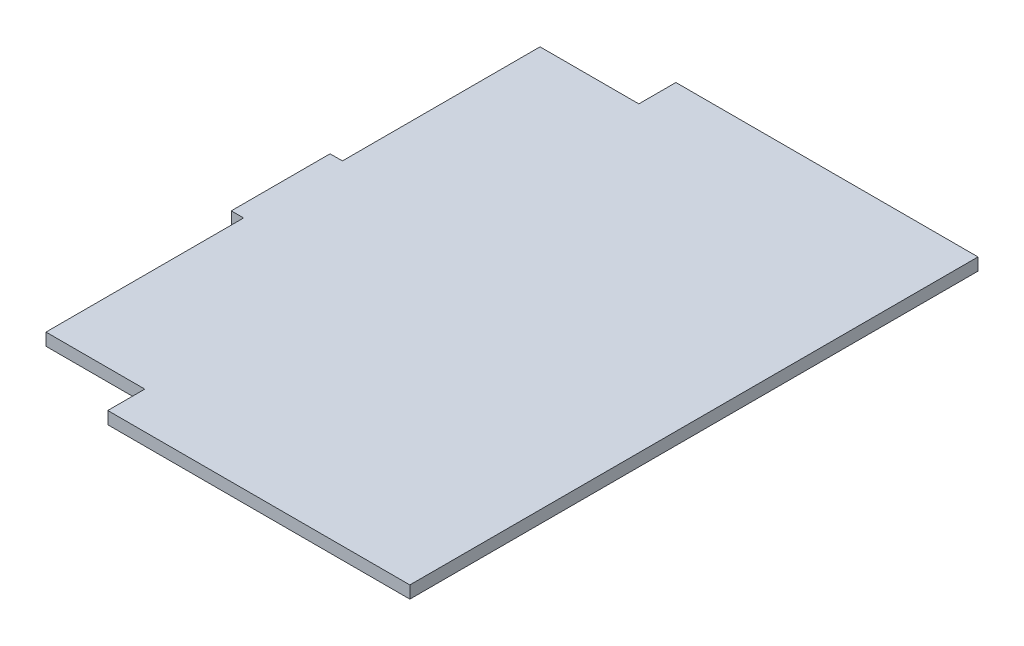
ISO-10303-21;
HEADER;
FILE_DESCRIPTION(('STEP AP214'),'2;1');
FILE_NAME('part.step','',(''),(''),'','','');
FILE_SCHEMA(('AUTOMOTIVE_DESIGN { 1 0 10303 214 1 1 1 1 }'));
ENDSEC;
DATA;
#1=APPLICATION_CONTEXT('core data for automotive mechanical design processes');
#2=APPLICATION_PROTOCOL_DEFINITION('international standard','automotive_design',2000,#1);
#3=PRODUCT_CONTEXT('',#1,'mechanical');
#4=PRODUCT('Part','Part','',(#3));
#5=PRODUCT_RELATED_PRODUCT_CATEGORY('part','',(#4));
#6=PRODUCT_DEFINITION_FORMATION('','',#4);
#7=PRODUCT_DEFINITION_CONTEXT('part definition',#1,'design');
#8=PRODUCT_DEFINITION('design','',#6,#7);
#9=PRODUCT_DEFINITION_SHAPE('','',#8);
#10=(LENGTH_UNIT() NAMED_UNIT(*) SI_UNIT(.MILLI.,.METRE.));
#11=(NAMED_UNIT(*) PLANE_ANGLE_UNIT() SI_UNIT($,.RADIAN.));
#12=(NAMED_UNIT(*) SI_UNIT($,.STERADIAN.) SOLID_ANGLE_UNIT());
#13=UNCERTAINTY_MEASURE_WITH_UNIT(LENGTH_MEASURE(1.E-05),#10,'distance_accuracy_value','');
#14=(GEOMETRIC_REPRESENTATION_CONTEXT(3) GLOBAL_UNCERTAINTY_ASSIGNED_CONTEXT((#13)) GLOBAL_UNIT_ASSIGNED_CONTEXT((#10,
#11,#12)) REPRESENTATION_CONTEXT('',''));
#15=CARTESIAN_POINT('',(0.,0.,0.));
#16=DIRECTION('',(0.,0.,1.));
#17=DIRECTION('',(1.,0.,0.));
#18=AXIS2_PLACEMENT_3D('',#15,#16,#17);
#19=CARTESIAN_POINT('',(0.,3.175,73.025));
#20=DIRECTION('',(0.,0.,1.));
#21=DIRECTION('',(1.,0.,0.));
#22=AXIS2_PLACEMENT_3D('',#19,#20,#21);
#23=PLANE('',#22);
#24=DIRECTION('',(0.,-1.,0.));
#25=VECTOR('',#24,1.);
#26=CARTESIAN_POINT('',(36.926256602,3.175,73.025));
#27=LINE('',#26,#25);
#28=CARTESIAN_POINT('',(36.926256602,3.175,73.025));
#29=VERTEX_POINT('',#28);
#30=CARTESIAN_POINT('',(36.926256602,0.,73.025));
#31=VERTEX_POINT('',#30);
#32=EDGE_CURVE('E53',#29,#31,#27,.T.);
#33=ORIENTED_EDGE('',*,*,#32,.F.);
#34=DIRECTION('',(-1.,0.,0.));
#35=VECTOR('',#34,1.);
#36=CARTESIAN_POINT('',(0.,3.175,73.025));
#37=LINE('',#36,#35);
#38=CARTESIAN_POINT('',(-40.7362566019999,3.175,73.025));
#39=VERTEX_POINT('',#38);
#40=EDGE_CURVE('E61',#29,#39,#37,.T.);
#41=ORIENTED_EDGE('',*,*,#40,.T.);
#42=DIRECTION('',(0.,-1.,0.));
#43=VECTOR('',#42,1.);
#44=CARTESIAN_POINT('',(-40.7362566019999,3.175,73.025));
#45=LINE('',#44,#43);
#46=CARTESIAN_POINT('',(-40.7362566019999,0.,73.025));
#47=VERTEX_POINT('',#46);
#48=EDGE_CURVE('E218',#39,#47,#45,.T.);
#49=ORIENTED_EDGE('',*,*,#48,.T.);
#50=DIRECTION('',(-1.,0.,0.));
#51=VECTOR('',#50,1.);
#52=CARTESIAN_POINT('',(0.,0.,73.025));
#53=LINE('',#52,#51);
#54=EDGE_CURVE('E101',#31,#47,#53,.T.);
#55=ORIENTED_EDGE('',*,*,#54,.F.);
#56=EDGE_LOOP('',(#33,#41,#49,#55));
#57=FACE_BOUND('',#56,.T.);
#58=ADVANCED_FACE('F39',(#57),#23,.T.);
#59=CARTESIAN_POINT('',(0.,3.175,-73.025));
#60=DIRECTION('',(0.,0.,1.));
#61=DIRECTION('',(1.,0.,0.));
#62=AXIS2_PLACEMENT_3D('',#59,#60,#61);
#63=PLANE('',#62);
#64=DIRECTION('',(-1.,0.,0.));
#65=VECTOR('',#64,1.);
#66=CARTESIAN_POINT('',(0.,3.175,-73.025));
#67=LINE('',#66,#65);
#68=CARTESIAN_POINT('',(36.926256602,3.175,-73.025));
#69=VERTEX_POINT('',#68);
#70=CARTESIAN_POINT('',(-40.7362566019999,3.175,-73.025));
#71=VERTEX_POINT('',#70);
#72=EDGE_CURVE('E109',#69,#71,#67,.T.);
#73=ORIENTED_EDGE('',*,*,#72,.F.);
#74=DIRECTION('',(0.,-1.,0.));
#75=VECTOR('',#74,1.);
#76=CARTESIAN_POINT('',(36.926256602,3.175,-73.025));
#77=LINE('',#76,#75);
#78=CARTESIAN_POINT('',(36.926256602,0.,-73.025));
#79=VERTEX_POINT('',#78);
#80=EDGE_CURVE('E179',#69,#79,#77,.T.);
#81=ORIENTED_EDGE('',*,*,#80,.T.);
#82=DIRECTION('',(-1.,0.,0.));
#83=VECTOR('',#82,1.);
#84=CARTESIAN_POINT('',(0.,0.,-73.025));
#85=LINE('',#84,#83);
#86=CARTESIAN_POINT('',(-40.7362566019999,0.,-73.025));
#87=VERTEX_POINT('',#86);
#88=EDGE_CURVE('E193',#79,#87,#85,.T.);
#89=ORIENTED_EDGE('',*,*,#88,.T.);
#90=DIRECTION('',(0.,-1.,0.));
#91=VECTOR('',#90,1.);
#92=CARTESIAN_POINT('',(-40.7362566019999,3.175,-73.025));
#93=LINE('',#92,#91);
#94=EDGE_CURVE('E11',#71,#87,#93,.T.);
#95=ORIENTED_EDGE('',*,*,#94,.F.);
#96=EDGE_LOOP('',(#73,#81,#89,#95));
#97=FACE_BOUND('',#96,.T.);
#98=ADVANCED_FACE('F190',(#97),#63,.F.);
#99=CARTESIAN_POINT('',(-40.7362566019999,3.175,0.));
#100=DIRECTION('',(1.,0.,0.));
#101=DIRECTION('',(0.,0.,-1.));
#102=AXIS2_PLACEMENT_3D('',#99,#100,#101);
#103=PLANE('',#102);
#104=DIRECTION('',(0.,0.,1.));
#105=VECTOR('',#104,1.);
#106=CARTESIAN_POINT('',(-40.7362566019999,0.,0.));
#107=LINE('',#106,#105);
#108=CARTESIAN_POINT('',(-40.7362566019999,0.,-63.5));
#109=VERTEX_POINT('',#108);
#110=EDGE_CURVE('E221',#87,#109,#107,.T.);
#111=ORIENTED_EDGE('',*,*,#110,.T.);
#112=DIRECTION('',(0.,-1.,0.));
#113=VECTOR('',#112,1.);
#114=CARTESIAN_POINT('',(-40.7362566019999,3.175,-63.5));
#115=LINE('',#114,#113);
#116=CARTESIAN_POINT('',(-40.7362566019999,3.175,-63.5));
#117=VERTEX_POINT('',#116);
#118=EDGE_CURVE('E46',#117,#109,#115,.T.);
#119=ORIENTED_EDGE('',*,*,#118,.F.);
#120=DIRECTION('',(0.,0.,1.));
#121=VECTOR('',#120,1.);
#122=CARTESIAN_POINT('',(-40.7362566019999,3.175,0.));
#123=LINE('',#122,#121);
#124=EDGE_CURVE('E171',#71,#117,#123,.T.);
#125=ORIENTED_EDGE('',*,*,#124,.F.);
#126=ORIENTED_EDGE('',*,*,#94,.T.);
#127=EDGE_LOOP('',(#111,#119,#125,#126));
#128=FACE_BOUND('',#127,.T.);
#129=ADVANCED_FACE('F198',(#128),#103,.F.);
#130=CARTESIAN_POINT('',(0.,3.175,-63.5));
#131=DIRECTION('',(0.,0.,-1.));
#132=DIRECTION('',(-1.,0.,0.));
#133=AXIS2_PLACEMENT_3D('',#130,#131,#132);
#134=PLANE('',#133);
#135=DIRECTION('',(1.,0.,0.));
#136=VECTOR('',#135,1.);
#137=CARTESIAN_POINT('',(0.,0.,-63.5));
#138=LINE('',#137,#136);
#139=CARTESIAN_POINT('',(-66.136256602,0.,-63.5));
#140=VERTEX_POINT('',#139);
#141=EDGE_CURVE('E223',#140,#109,#138,.T.);
#142=ORIENTED_EDGE('',*,*,#141,.F.);
#143=DIRECTION('',(0.,-1.,0.));
#144=VECTOR('',#143,1.);
#145=CARTESIAN_POINT('',(-66.136256602,3.175,-63.5));
#146=LINE('',#145,#144);
#147=CARTESIAN_POINT('',(-66.136256602,3.175,-63.5));
#148=VERTEX_POINT('',#147);
#149=EDGE_CURVE('E243',#148,#140,#146,.T.);
#150=ORIENTED_EDGE('',*,*,#149,.F.);
#151=DIRECTION('',(1.,0.,0.));
#152=VECTOR('',#151,1.);
#153=CARTESIAN_POINT('',(0.,3.175,-63.5));
#154=LINE('',#153,#152);
#155=EDGE_CURVE('E167',#148,#117,#154,.T.);
#156=ORIENTED_EDGE('',*,*,#155,.T.);
#157=ORIENTED_EDGE('',*,*,#118,.T.);
#158=EDGE_LOOP('',(#142,#150,#156,#157));
#159=FACE_BOUND('',#158,.T.);
#160=ADVANCED_FACE('F245',(#159),#134,.T.);
#161=CARTESIAN_POINT('',(-66.136256602,3.175,0.));
#162=DIRECTION('',(-1.,0.,0.));
#163=DIRECTION('',(0.,0.,1.));
#164=AXIS2_PLACEMENT_3D('',#161,#162,#163);
#165=PLANE('',#164);
#166=DIRECTION('',(0.,0.,-1.));
#167=VECTOR('',#166,1.);
#168=CARTESIAN_POINT('',(-66.136256602,0.,0.));
#169=LINE('',#168,#167);
#170=CARTESIAN_POINT('',(-66.136256602,0.,-12.7));
#171=VERTEX_POINT('',#170);
#172=EDGE_CURVE('E226',#171,#140,#169,.T.);
#173=ORIENTED_EDGE('',*,*,#172,.F.);
#174=DIRECTION('',(0.,-1.,0.));
#175=VECTOR('',#174,1.);
#176=CARTESIAN_POINT('',(-66.136256602,3.175,-12.7));
#177=LINE('',#176,#175);
#178=CARTESIAN_POINT('',(-66.136256602,3.175,-12.7));
#179=VERTEX_POINT('',#178);
#180=EDGE_CURVE('E211',#179,#171,#177,.T.);
#181=ORIENTED_EDGE('',*,*,#180,.F.);
#182=DIRECTION('',(0.,0.,-1.));
#183=VECTOR('',#182,1.);
#184=CARTESIAN_POINT('',(-66.136256602,3.175,0.));
#185=LINE('',#184,#183);
#186=EDGE_CURVE('E160',#179,#148,#185,.T.);
#187=ORIENTED_EDGE('',*,*,#186,.T.);
#188=ORIENTED_EDGE('',*,*,#149,.T.);
#189=EDGE_LOOP('',(#173,#181,#187,#188));
#190=FACE_BOUND('',#189,.T.);
#191=ADVANCED_FACE('F248',(#190),#165,.T.);
#192=CARTESIAN_POINT('',(0.,3.175,-12.7));
#193=DIRECTION('',(0.,0.,1.));
#194=DIRECTION('',(1.,0.,0.));
#195=AXIS2_PLACEMENT_3D('',#192,#193,#194);
#196=PLANE('',#195);
#197=DIRECTION('',(-1.,0.,0.));
#198=VECTOR('',#197,1.);
#199=CARTESIAN_POINT('',(0.,0.,-12.7));
#200=LINE('',#199,#198);
#201=CARTESIAN_POINT('',(-69.311256602,0.,-12.7));
#202=VERTEX_POINT('',#201);
#203=EDGE_CURVE('E207',#171,#202,#200,.T.);
#204=ORIENTED_EDGE('',*,*,#203,.T.);
#205=DIRECTION('',(0.,-1.,0.));
#206=VECTOR('',#205,1.);
#207=CARTESIAN_POINT('',(-69.311256602,3.175,-12.7));
#208=LINE('',#207,#206);
#209=CARTESIAN_POINT('',(-69.311256602,3.175,-12.7));
#210=VERTEX_POINT('',#209);
#211=EDGE_CURVE('E204',#210,#202,#208,.T.);
#212=ORIENTED_EDGE('',*,*,#211,.F.);
#213=DIRECTION('',(-1.,0.,0.));
#214=VECTOR('',#213,1.);
#215=CARTESIAN_POINT('',(0.,3.175,-12.7));
#216=LINE('',#215,#214);
#217=EDGE_CURVE('E166',#179,#210,#216,.T.);
#218=ORIENTED_EDGE('',*,*,#217,.F.);
#219=ORIENTED_EDGE('',*,*,#180,.T.);
#220=EDGE_LOOP('',(#204,#212,#218,#219));
#221=FACE_BOUND('',#220,.T.);
#222=ADVANCED_FACE('F205',(#221),#196,.F.);
#223=CARTESIAN_POINT('',(-69.311256602,3.175,0.));
#224=DIRECTION('',(-1.,0.,0.));
#225=DIRECTION('',(0.,0.,1.));
#226=AXIS2_PLACEMENT_3D('',#223,#224,#225);
#227=PLANE('',#226);
#228=DIRECTION('',(0.,0.,-1.));
#229=VECTOR('',#228,1.);
#230=CARTESIAN_POINT('',(-69.311256602,0.,0.));
#231=LINE('',#230,#229);
#232=CARTESIAN_POINT('',(-69.311256602,0.,12.7));
#233=VERTEX_POINT('',#232);
#234=EDGE_CURVE('E230',#233,#202,#231,.T.);
#235=ORIENTED_EDGE('',*,*,#234,.F.);
#236=DIRECTION('',(0.,-1.,0.));
#237=VECTOR('',#236,1.);
#238=CARTESIAN_POINT('',(-69.311256602,3.175,12.7));
#239=LINE('',#238,#237);
#240=CARTESIAN_POINT('',(-69.311256602,3.175,12.7));
#241=VERTEX_POINT('',#240);
#242=EDGE_CURVE('E212',#241,#233,#239,.T.);
#243=ORIENTED_EDGE('',*,*,#242,.F.);
#244=DIRECTION('',(0.,0.,-1.));
#245=VECTOR('',#244,1.);
#246=CARTESIAN_POINT('',(-69.311256602,3.175,0.));
#247=LINE('',#246,#245);
#248=EDGE_CURVE('E161',#241,#210,#247,.T.);
#249=ORIENTED_EDGE('',*,*,#248,.T.);
#250=ORIENTED_EDGE('',*,*,#211,.T.);
#251=EDGE_LOOP('',(#235,#243,#249,#250));
#252=FACE_BOUND('',#251,.T.);
#253=ADVANCED_FACE('F214',(#252),#227,.T.);
#254=CARTESIAN_POINT('',(0.,3.175,12.7));
#255=DIRECTION('',(0.,0.,1.));
#256=DIRECTION('',(1.,0.,0.));
#257=AXIS2_PLACEMENT_3D('',#254,#255,#256);
#258=PLANE('',#257);
#259=DIRECTION('',(-1.,0.,0.));
#260=VECTOR('',#259,1.);
#261=CARTESIAN_POINT('',(0.,0.,12.7));
#262=LINE('',#261,#260);
#263=CARTESIAN_POINT('',(-66.136256602,0.,12.7));
#264=VERTEX_POINT('',#263);
#265=EDGE_CURVE('E232',#264,#233,#262,.T.);
#266=ORIENTED_EDGE('',*,*,#265,.F.);
#267=DIRECTION('',(0.,-1.,0.));
#268=VECTOR('',#267,1.);
#269=CARTESIAN_POINT('',(-66.136256602,3.175,12.7));
#270=LINE('',#269,#268);
#271=CARTESIAN_POINT('',(-66.136256602,3.175,12.7));
#272=VERTEX_POINT('',#271);
#273=EDGE_CURVE('E144',#272,#264,#270,.T.);
#274=ORIENTED_EDGE('',*,*,#273,.F.);
#275=DIRECTION('',(-1.,0.,0.));
#276=VECTOR('',#275,1.);
#277=CARTESIAN_POINT('',(0.,3.175,12.7));
#278=LINE('',#277,#276);
#279=EDGE_CURVE('E158',#272,#241,#278,.T.);
#280=ORIENTED_EDGE('',*,*,#279,.T.);
#281=ORIENTED_EDGE('',*,*,#242,.T.);
#282=EDGE_LOOP('',(#266,#274,#280,#281));
#283=FACE_BOUND('',#282,.T.);
#284=ADVANCED_FACE('F260',(#283),#258,.T.);
#285=CARTESIAN_POINT('',(-66.136256602,0.,63.5));
#286=VERTEX_POINT('',#285);
#287=EDGE_CURVE('E140',#286,#264,#169,.T.);
#288=ORIENTED_EDGE('',*,*,#287,.F.);
#289=DIRECTION('',(0.,-1.,0.));
#290=VECTOR('',#289,1.);
#291=CARTESIAN_POINT('',(-66.136256602,3.175,63.5));
#292=LINE('',#291,#290);
#293=CARTESIAN_POINT('',(-66.136256602,3.175,63.5));
#294=VERTEX_POINT('',#293);
#295=EDGE_CURVE('E134',#294,#286,#292,.T.);
#296=ORIENTED_EDGE('',*,*,#295,.F.);
#297=EDGE_CURVE('E138',#294,#272,#185,.T.);
#298=ORIENTED_EDGE('',*,*,#297,.T.);
#299=ORIENTED_EDGE('',*,*,#273,.T.);
#300=EDGE_LOOP('',(#288,#296,#298,#299));
#301=FACE_BOUND('',#300,.T.);
#302=ADVANCED_FACE('F136',(#301),#165,.T.);
#303=CARTESIAN_POINT('',(0.,3.175,63.5));
#304=DIRECTION('',(0.,0.,-1.));
#305=DIRECTION('',(-1.,0.,0.));
#306=AXIS2_PLACEMENT_3D('',#303,#304,#305);
#307=PLANE('',#306);
#308=DIRECTION('',(1.,0.,0.));
#309=VECTOR('',#308,1.);
#310=CARTESIAN_POINT('',(0.,0.,63.5));
#311=LINE('',#310,#309);
#312=CARTESIAN_POINT('',(-40.7362566019999,0.,63.5));
#313=VERTEX_POINT('',#312);
#314=EDGE_CURVE('E235',#286,#313,#311,.T.);
#315=ORIENTED_EDGE('',*,*,#314,.T.);
#316=DIRECTION('',(0.,-1.,0.));
#317=VECTOR('',#316,1.);
#318=CARTESIAN_POINT('',(-40.7362566019999,3.175,63.5));
#319=LINE('',#318,#317);
#320=CARTESIAN_POINT('',(-40.7362566019999,3.175,63.5));
#321=VERTEX_POINT('',#320);
#322=EDGE_CURVE('E145',#321,#313,#319,.T.);
#323=ORIENTED_EDGE('',*,*,#322,.F.);
#324=DIRECTION('',(1.,0.,0.));
#325=VECTOR('',#324,1.);
#326=CARTESIAN_POINT('',(0.,3.175,63.5));
#327=LINE('',#326,#325);
#328=EDGE_CURVE('E148',#294,#321,#327,.T.);
#329=ORIENTED_EDGE('',*,*,#328,.F.);
#330=ORIENTED_EDGE('',*,*,#295,.T.);
#331=EDGE_LOOP('',(#315,#323,#329,#330));
#332=FACE_BOUND('',#331,.T.);
#333=ADVANCED_FACE('F149',(#332),#307,.F.);
#334=CARTESIAN_POINT('',(-40.736256602,3.175,0.));
#335=DIRECTION('',(-1.,0.,0.));
#336=DIRECTION('',(0.,0.,1.));
#337=AXIS2_PLACEMENT_3D('',#334,#335,#336);
#338=PLANE('',#337);
#339=DIRECTION('',(0.,0.,-1.));
#340=VECTOR('',#339,1.);
#341=CARTESIAN_POINT('',(-40.736256602,0.,0.));
#342=LINE('',#341,#340);
#343=EDGE_CURVE('E178',#47,#313,#342,.T.);
#344=ORIENTED_EDGE('',*,*,#343,.F.);
#345=ORIENTED_EDGE('',*,*,#48,.F.);
#346=DIRECTION('',(0.,0.,-1.));
#347=VECTOR('',#346,1.);
#348=CARTESIAN_POINT('',(-40.736256602,3.175,0.));
#349=LINE('',#348,#347);
#350=EDGE_CURVE('E152',#39,#321,#349,.T.);
#351=ORIENTED_EDGE('',*,*,#350,.T.);
#352=ORIENTED_EDGE('',*,*,#322,.T.);
#353=EDGE_LOOP('',(#344,#345,#351,#352));
#354=FACE_BOUND('',#353,.T.);
#355=ADVANCED_FACE('F267',(#354),#338,.T.);
#356=CARTESIAN_POINT('',(0.,3.175,0.));
#357=DIRECTION('',(0.,1.,0.));
#358=DIRECTION('',(0.,0.,1.));
#359=AXIS2_PLACEMENT_3D('',#356,#357,#358);
#360=PLANE('',#359);
#361=DIRECTION('',(0.,0.,-1.));
#362=VECTOR('',#361,1.);
#363=CARTESIAN_POINT('',(36.926256602,3.175,-73.025));
#364=LINE('',#363,#362);
#365=EDGE_CURVE('E182',#29,#69,#364,.T.);
#366=ORIENTED_EDGE('',*,*,#365,.T.);
#367=ORIENTED_EDGE('',*,*,#72,.T.);
#368=ORIENTED_EDGE('',*,*,#124,.T.);
#369=ORIENTED_EDGE('',*,*,#155,.F.);
#370=ORIENTED_EDGE('',*,*,#186,.F.);
#371=ORIENTED_EDGE('',*,*,#217,.T.);
#372=ORIENTED_EDGE('',*,*,#248,.F.);
#373=ORIENTED_EDGE('',*,*,#279,.F.);
#374=ORIENTED_EDGE('',*,*,#297,.F.);
#375=ORIENTED_EDGE('',*,*,#328,.T.);
#376=ORIENTED_EDGE('',*,*,#350,.F.);
#377=ORIENTED_EDGE('',*,*,#40,.F.);
#378=EDGE_LOOP('',(#366,#367,#368,#369,#370,#371,#372,#373,#374,#375,#376,#377));
#379=FACE_BOUND('',#378,.T.);
#380=ADVANCED_FACE('F155',(#379),#360,.T.);
#381=CARTESIAN_POINT('',(0.,0.,0.));
#382=DIRECTION('',(0.,1.,0.));
#383=DIRECTION('',(0.,0.,1.));
#384=AXIS2_PLACEMENT_3D('',#381,#382,#383);
#385=PLANE('',#384);
#386=ORIENTED_EDGE('',*,*,#88,.F.);
#387=DIRECTION('',(0.,0.,-1.));
#388=VECTOR('',#387,1.);
#389=CARTESIAN_POINT('',(36.926256602,0.,-73.025));
#390=LINE('',#389,#388);
#391=EDGE_CURVE('E184',#31,#79,#390,.T.);
#392=ORIENTED_EDGE('',*,*,#391,.F.);
#393=ORIENTED_EDGE('',*,*,#54,.T.);
#394=ORIENTED_EDGE('',*,*,#343,.T.);
#395=ORIENTED_EDGE('',*,*,#314,.F.);
#396=ORIENTED_EDGE('',*,*,#287,.T.);
#397=ORIENTED_EDGE('',*,*,#265,.T.);
#398=ORIENTED_EDGE('',*,*,#234,.T.);
#399=ORIENTED_EDGE('',*,*,#203,.F.);
#400=ORIENTED_EDGE('',*,*,#172,.T.);
#401=ORIENTED_EDGE('',*,*,#141,.T.);
#402=ORIENTED_EDGE('',*,*,#110,.F.);
#403=EDGE_LOOP('',(#386,#392,#393,#394,#395,#396,#397,#398,#399,#400,#401,#402));
#404=FACE_BOUND('',#403,.T.);
#405=ADVANCED_FACE('F246',(#404),#385,.F.);
#406=CARTESIAN_POINT('',(36.926256602,3.175,-73.025));
#407=DIRECTION('',(-1.,0.,0.));
#408=DIRECTION('',(0.,0.,1.));
#409=AXIS2_PLACEMENT_3D('',#406,#407,#408);
#410=PLANE('',#409);
#411=ORIENTED_EDGE('',*,*,#391,.T.);
#412=ORIENTED_EDGE('',*,*,#80,.F.);
#413=ORIENTED_EDGE('',*,*,#365,.F.);
#414=ORIENTED_EDGE('',*,*,#32,.T.);
#415=EDGE_LOOP('',(#411,#412,#413,#414));
#416=FACE_BOUND('',#415,.T.);
#417=ADVANCED_FACE('F355',(#416),#410,.F.);
#418=CLOSED_SHELL('',(#58,#98,#129,#160,#191,#222,#253,#284,#302,#333,#355,#380,#405,#417));
#419=MANIFOLD_SOLID_BREP('B2',#418);
#420=ADVANCED_BREP_SHAPE_REPRESENTATION('',(#18,#419),#14);
#421=SHAPE_DEFINITION_REPRESENTATION(#9,#420);
ENDSEC;
END-ISO-10303-21;
